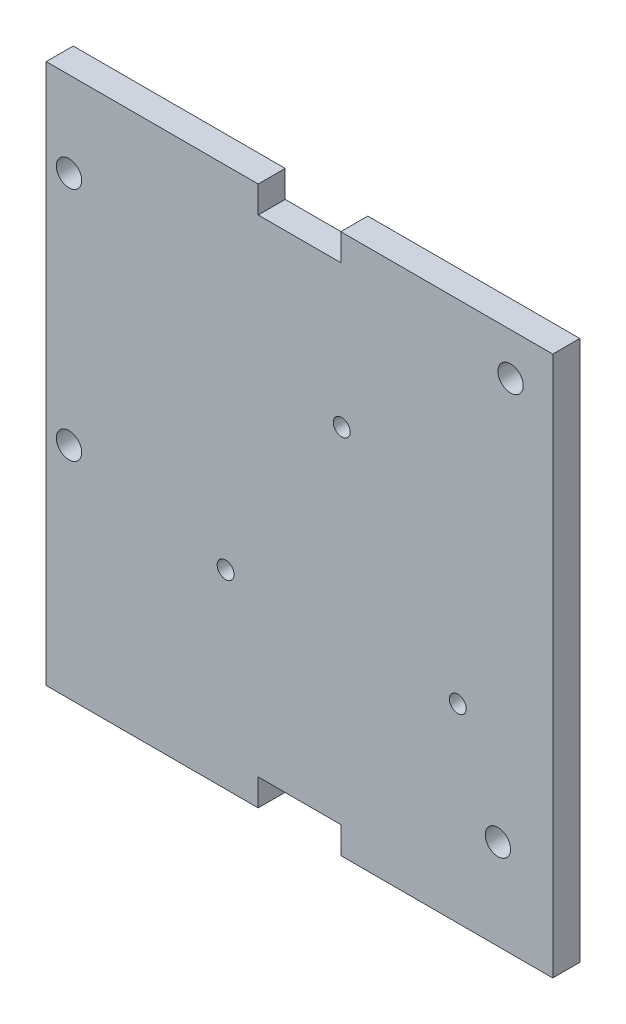
ISO-10303-21;
HEADER;
FILE_DESCRIPTION(('STEP AP214'),'2;1');
FILE_NAME('part.step','',(''),(''),'','','');
FILE_SCHEMA(('AUTOMOTIVE_DESIGN { 1 0 10303 214 1 1 1 1 }'));
ENDSEC;
DATA;
#1=APPLICATION_CONTEXT('core data for automotive mechanical design processes');
#2=APPLICATION_PROTOCOL_DEFINITION('international standard','automotive_design',2000,#1);
#3=PRODUCT_CONTEXT('',#1,'mechanical');
#4=PRODUCT('Part','Part','',(#3));
#5=PRODUCT_RELATED_PRODUCT_CATEGORY('part','',(#4));
#6=PRODUCT_DEFINITION_FORMATION('','',#4);
#7=PRODUCT_DEFINITION_CONTEXT('part definition',#1,'design');
#8=PRODUCT_DEFINITION('design','',#6,#7);
#9=PRODUCT_DEFINITION_SHAPE('','',#8);
#10=(LENGTH_UNIT() NAMED_UNIT(*) SI_UNIT(.MILLI.,.METRE.));
#11=(NAMED_UNIT(*) PLANE_ANGLE_UNIT() SI_UNIT($,.RADIAN.));
#12=(NAMED_UNIT(*) SI_UNIT($,.STERADIAN.) SOLID_ANGLE_UNIT());
#13=UNCERTAINTY_MEASURE_WITH_UNIT(LENGTH_MEASURE(1.E-05),#10,'distance_accuracy_value','');
#14=(GEOMETRIC_REPRESENTATION_CONTEXT(3) GLOBAL_UNCERTAINTY_ASSIGNED_CONTEXT((#13)) GLOBAL_UNIT_ASSIGNED_CONTEXT((#10,
#11,#12)) REPRESENTATION_CONTEXT('',''));
#15=CARTESIAN_POINT('',(0.,0.,0.));
#16=DIRECTION('',(0.,0.,1.));
#17=DIRECTION('',(1.,0.,0.));
#18=AXIS2_PLACEMENT_3D('',#15,#16,#17);
#19=CARTESIAN_POINT('',(-32.5493753276808,-8.36083374736063,3.2));
#20=DIRECTION('',(0.,1.,0.));
#21=DIRECTION('',(0.,0.,1.));
#22=AXIS2_PLACEMENT_3D('',#19,#20,#21);
#23=PLANE('',#22);
#24=DIRECTION('',(1.,0.,0.));
#25=VECTOR('',#24,1.);
#26=CARTESIAN_POINT('',(-32.5493753276808,-8.36083374736063,3.2));
#27=LINE('',#26,#25);
#28=CARTESIAN_POINT('',(2.34062467231918,-8.36083374736063,3.2));
#29=VERTEX_POINT('',#28);
#30=CARTESIAN_POINT('',(27.4506246723192,-8.36083374736063,3.2));
#31=VERTEX_POINT('',#30);
#32=EDGE_CURVE('E214',#29,#31,#27,.T.);
#33=ORIENTED_EDGE('',*,*,#32,.F.);
#34=DIRECTION('',(0.,0.,-1.));
#35=VECTOR('',#34,1.);
#36=CARTESIAN_POINT('',(2.34062467231918,-8.36083374736063,10.));
#37=LINE('',#36,#35);
#38=CARTESIAN_POINT('',(2.34062467231918,-8.36083374736063,0.));
#39=VERTEX_POINT('',#38);
#40=EDGE_CURVE('E213',#29,#39,#37,.T.);
#41=ORIENTED_EDGE('',*,*,#40,.T.);
#42=DIRECTION('',(1.,0.,0.));
#43=VECTOR('',#42,1.);
#44=CARTESIAN_POINT('',(-32.5493753276808,-8.36083374736063,0.));
#45=LINE('',#44,#43);
#46=CARTESIAN_POINT('',(27.4506246723192,-8.36083374736063,0.));
#47=VERTEX_POINT('',#46);
#48=EDGE_CURVE('E193',#39,#47,#45,.T.);
#49=ORIENTED_EDGE('',*,*,#48,.T.);
#50=DIRECTION('',(0.,0.,-1.));
#51=VECTOR('',#50,1.);
#52=CARTESIAN_POINT('',(27.4506246723192,-8.36083374736063,3.2));
#53=LINE('',#52,#51);
#54=EDGE_CURVE('E48',#31,#47,#53,.T.);
#55=ORIENTED_EDGE('',*,*,#54,.F.);
#56=EDGE_LOOP('',(#33,#41,#49,#55));
#57=FACE_BOUND('',#56,.T.);
#58=ADVANCED_FACE('F39',(#57),#23,.F.);
#59=CARTESIAN_POINT('',(-32.5493753276808,55.6391662526394,3.2));
#60=DIRECTION('',(0.,-1.,0.));
#61=DIRECTION('',(0.,0.,-1.));
#62=AXIS2_PLACEMENT_3D('',#59,#60,#61);
#63=PLANE('',#62);
#64=DIRECTION('',(-1.,0.,0.));
#65=VECTOR('',#64,1.);
#66=CARTESIAN_POINT('',(-32.5493753276808,55.6391662526394,3.2));
#67=LINE('',#66,#65);
#68=CARTESIAN_POINT('',(-7.43937532768082,55.6391662526394,3.2));
#69=VERTEX_POINT('',#68);
#70=CARTESIAN_POINT('',(-32.5493753276808,55.6391662526394,3.2));
#71=VERTEX_POINT('',#70);
#72=EDGE_CURVE('E151',#69,#71,#67,.T.);
#73=ORIENTED_EDGE('',*,*,#72,.F.);
#74=DIRECTION('',(0.,0.,-1.));
#75=VECTOR('',#74,1.);
#76=CARTESIAN_POINT('',(-7.43937532768082,55.6391662526394,10.));
#77=LINE('',#76,#75);
#78=CARTESIAN_POINT('',(-7.43937532768082,55.6391662526394,0.));
#79=VERTEX_POINT('',#78);
#80=EDGE_CURVE('E133',#69,#79,#77,.T.);
#81=ORIENTED_EDGE('',*,*,#80,.T.);
#82=DIRECTION('',(-1.,0.,0.));
#83=VECTOR('',#82,1.);
#84=CARTESIAN_POINT('',(-32.5493753276808,55.6391662526394,0.));
#85=LINE('',#84,#83);
#86=CARTESIAN_POINT('',(-32.5493753276808,55.6391662526394,0.));
#87=VERTEX_POINT('',#86);
#88=EDGE_CURVE('E149',#79,#87,#85,.T.);
#89=ORIENTED_EDGE('',*,*,#88,.T.);
#90=DIRECTION('',(0.,0.,-1.));
#91=VECTOR('',#90,1.);
#92=CARTESIAN_POINT('',(-32.5493753276808,55.6391662526394,3.2));
#93=LINE('',#92,#91);
#94=EDGE_CURVE('E172',#71,#87,#93,.T.);
#95=ORIENTED_EDGE('',*,*,#94,.F.);
#96=EDGE_LOOP('',(#73,#81,#89,#95));
#97=FACE_BOUND('',#96,.T.);
#98=ADVANCED_FACE('F147',(#97),#63,.F.);
#99=CARTESIAN_POINT('',(-32.5493753276808,-8.36083374736063,3.2));
#100=DIRECTION('',(1.,0.,0.));
#101=DIRECTION('',(0.,0.,-1.));
#102=AXIS2_PLACEMENT_3D('',#99,#100,#101);
#103=PLANE('',#102);
#104=DIRECTION('',(0.,-1.,0.));
#105=VECTOR('',#104,1.);
#106=CARTESIAN_POINT('',(-32.5493753276808,-8.36083374736063,0.));
#107=LINE('',#106,#105);
#108=CARTESIAN_POINT('',(-32.5493753276808,-8.36083374736063,0.));
#109=VERTEX_POINT('',#108);
#110=EDGE_CURVE('E159',#87,#109,#107,.T.);
#111=ORIENTED_EDGE('',*,*,#110,.T.);
#112=DIRECTION('',(0.,0.,-1.));
#113=VECTOR('',#112,1.);
#114=CARTESIAN_POINT('',(-32.5493753276808,-8.36083374736063,3.2));
#115=LINE('',#114,#113);
#116=CARTESIAN_POINT('',(-32.5493753276808,-8.36083374736063,3.2));
#117=VERTEX_POINT('',#116);
#118=EDGE_CURVE('E11',#117,#109,#115,.T.);
#119=ORIENTED_EDGE('',*,*,#118,.F.);
#120=DIRECTION('',(0.,-1.,0.));
#121=VECTOR('',#120,1.);
#122=CARTESIAN_POINT('',(-32.5493753276808,-8.36083374736063,3.2));
#123=LINE('',#122,#121);
#124=EDGE_CURVE('E167',#71,#117,#123,.T.);
#125=ORIENTED_EDGE('',*,*,#124,.F.);
#126=ORIENTED_EDGE('',*,*,#94,.T.);
#127=EDGE_LOOP('',(#111,#119,#125,#126));
#128=FACE_BOUND('',#127,.T.);
#129=ADVANCED_FACE('F41',(#128),#103,.F.);
#130=CARTESIAN_POINT('',(-7.43937532768082,-8.36083374736063,0.));
#131=VERTEX_POINT('',#130);
#132=EDGE_CURVE('E168',#109,#131,#45,.T.);
#133=ORIENTED_EDGE('',*,*,#132,.T.);
#134=DIRECTION('',(0.,0.,-1.));
#135=VECTOR('',#134,1.);
#136=CARTESIAN_POINT('',(-7.43937532768082,-8.36083374736063,10.));
#137=LINE('',#136,#135);
#138=CARTESIAN_POINT('',(-7.43937532768082,-8.36083374736063,3.2));
#139=VERTEX_POINT('',#138);
#140=EDGE_CURVE('E55',#139,#131,#137,.T.);
#141=ORIENTED_EDGE('',*,*,#140,.F.);
#142=EDGE_CURVE('E307',#117,#139,#27,.T.);
#143=ORIENTED_EDGE('',*,*,#142,.F.);
#144=ORIENTED_EDGE('',*,*,#118,.T.);
#145=EDGE_LOOP('',(#133,#141,#143,#144));
#146=FACE_BOUND('',#145,.T.);
#147=ADVANCED_FACE('F345',(#146),#23,.F.);
#148=CARTESIAN_POINT('',(27.4506246723192,-8.36083374736063,3.2));
#149=DIRECTION('',(-1.,0.,0.));
#150=DIRECTION('',(0.,0.,1.));
#151=AXIS2_PLACEMENT_3D('',#148,#149,#150);
#152=PLANE('',#151);
#153=DIRECTION('',(0.,1.,0.));
#154=VECTOR('',#153,1.);
#155=CARTESIAN_POINT('',(27.4506246723192,-8.36083374736063,0.));
#156=LINE('',#155,#154);
#157=CARTESIAN_POINT('',(27.4506246723192,55.6391662526394,0.));
#158=VERTEX_POINT('',#157);
#159=EDGE_CURVE('E162',#47,#158,#156,.T.);
#160=ORIENTED_EDGE('',*,*,#159,.T.);
#161=DIRECTION('',(0.,0.,-1.));
#162=VECTOR('',#161,1.);
#163=CARTESIAN_POINT('',(27.4506246723192,55.6391662526394,3.2));
#164=LINE('',#163,#162);
#165=CARTESIAN_POINT('',(27.4506246723192,55.6391662526394,3.2));
#166=VERTEX_POINT('',#165);
#167=EDGE_CURVE('E175',#166,#158,#164,.T.);
#168=ORIENTED_EDGE('',*,*,#167,.F.);
#169=DIRECTION('',(0.,1.,0.));
#170=VECTOR('',#169,1.);
#171=CARTESIAN_POINT('',(27.4506246723192,-8.36083374736063,3.2));
#172=LINE('',#171,#170);
#173=EDGE_CURVE('E187',#31,#166,#172,.T.);
#174=ORIENTED_EDGE('',*,*,#173,.F.);
#175=ORIENTED_EDGE('',*,*,#54,.T.);
#176=EDGE_LOOP('',(#160,#168,#174,#175));
#177=FACE_BOUND('',#176,.T.);
#178=ADVANCED_FACE('F185',(#177),#152,.F.);
#179=CARTESIAN_POINT('',(2.34062467231918,55.6391662526394,0.));
#180=VERTEX_POINT('',#179);
#181=EDGE_CURVE('E161',#158,#180,#85,.T.);
#182=ORIENTED_EDGE('',*,*,#181,.T.);
#183=DIRECTION('',(0.,0.,-1.));
#184=VECTOR('',#183,1.);
#185=CARTESIAN_POINT('',(2.34062467231918,55.6391662526394,10.));
#186=LINE('',#185,#184);
#187=CARTESIAN_POINT('',(2.34062467231918,55.6391662526394,3.2));
#188=VERTEX_POINT('',#187);
#189=EDGE_CURVE('E63',#188,#180,#186,.T.);
#190=ORIENTED_EDGE('',*,*,#189,.F.);
#191=EDGE_CURVE('E176',#166,#188,#67,.T.);
#192=ORIENTED_EDGE('',*,*,#191,.F.);
#193=ORIENTED_EDGE('',*,*,#167,.T.);
#194=EDGE_LOOP('',(#182,#190,#192,#193));
#195=FACE_BOUND('',#194,.T.);
#196=ADVANCED_FACE('F195',(#195),#63,.F.);
#197=CARTESIAN_POINT('',(0.,0.,3.2));
#198=DIRECTION('',(0.,0.,-1.));
#199=DIRECTION('',(-1.,0.,0.));
#200=AXIS2_PLACEMENT_3D('',#197,#198,#199);
#201=PLANE('',#200);
#202=CARTESIAN_POINT('',(2.45062467231918,35.6391662526394,3.2));
#203=DIRECTION('',(0.,0.,-1.));
#204=DIRECTION('',(-1.,0.,0.));
#205=AXIS2_PLACEMENT_3D('',#202,#203,#204);
#206=CIRCLE('',#205,1.);
#207=CARTESIAN_POINT('',(1.45062467231918,35.6391662526394,3.2));
#208=VERTEX_POINT('',#207);
#209=EDGE_CURVE('E251',#208,#208,#206,.T.);
#210=ORIENTED_EDGE('',*,*,#209,.T.);
#211=EDGE_LOOP('',(#210));
#212=FACE_BOUND('',#211,.T.);
#213=CARTESIAN_POINT('',(16.2006246723192,14.1391662526394,3.2));
#214=DIRECTION('',(0.,0.,-1.));
#215=DIRECTION('',(-1.,0.,0.));
#216=AXIS2_PLACEMENT_3D('',#213,#214,#215);
#217=CIRCLE('',#216,1.);
#218=CARTESIAN_POINT('',(15.2006246723192,14.1391662526394,3.2));
#219=VERTEX_POINT('',#218);
#220=EDGE_CURVE('E260',#219,#219,#217,.T.);
#221=ORIENTED_EDGE('',*,*,#220,.T.);
#222=EDGE_LOOP('',(#221));
#223=FACE_BOUND('',#222,.T.);
#224=CARTESIAN_POINT('',(-11.2993753276808,14.1391662526394,3.2));
#225=DIRECTION('',(0.,0.,-1.));
#226=DIRECTION('',(-1.,0.,0.));
#227=AXIS2_PLACEMENT_3D('',#224,#225,#226);
#228=CIRCLE('',#227,1.);
#229=CARTESIAN_POINT('',(-12.2993753276808,14.1391662526394,3.2));
#230=VERTEX_POINT('',#229);
#231=EDGE_CURVE('E268',#230,#230,#228,.T.);
#232=ORIENTED_EDGE('',*,*,#231,.T.);
#233=EDGE_LOOP('',(#232));
#234=FACE_BOUND('',#233,.T.);
#235=CARTESIAN_POINT('',(20.9506246723192,2.33916625263938,3.2));
#236=DIRECTION('',(0.,0.,1.));
#237=DIRECTION('',(1.,0.,0.));
#238=AXIS2_PLACEMENT_3D('',#235,#236,#237);
#239=CIRCLE('',#238,1.5);
#240=CARTESIAN_POINT('',(22.4506246723192,2.33916625263938,3.2));
#241=VERTEX_POINT('',#240);
#242=EDGE_CURVE('E278',#241,#241,#239,.T.);
#243=ORIENTED_EDGE('',*,*,#242,.F.);
#244=EDGE_LOOP('',(#243));
#245=FACE_BOUND('',#244,.T.);
#246=CARTESIAN_POINT('',(-29.8493753276808,45.5391662526394,3.2));
#247=DIRECTION('',(0.,0.,1.));
#248=DIRECTION('',(1.,0.,0.));
#249=AXIS2_PLACEMENT_3D('',#246,#247,#248);
#250=CIRCLE('',#249,1.5);
#251=CARTESIAN_POINT('',(-28.3493753276808,45.5391662526394,3.2));
#252=VERTEX_POINT('',#251);
#253=EDGE_CURVE('E255',#252,#252,#250,.T.);
#254=ORIENTED_EDGE('',*,*,#253,.F.);
#255=EDGE_LOOP('',(#254));
#256=FACE_BOUND('',#255,.T.);
#257=CARTESIAN_POINT('',(-29.8493753276808,17.6391662526394,3.2));
#258=DIRECTION('',(0.,0.,1.));
#259=DIRECTION('',(1.,0.,0.));
#260=AXIS2_PLACEMENT_3D('',#257,#258,#259);
#261=CIRCLE('',#260,1.5);
#262=CARTESIAN_POINT('',(-28.3493753276808,17.6391662526394,3.2));
#263=VERTEX_POINT('',#262);
#264=EDGE_CURVE('E287',#263,#263,#261,.T.);
#265=ORIENTED_EDGE('',*,*,#264,.F.);
#266=EDGE_LOOP('',(#265));
#267=FACE_BOUND('',#266,.T.);
#268=CARTESIAN_POINT('',(22.4506246723192,50.6391662526394,3.2));
#269=DIRECTION('',(0.,0.,1.));
#270=DIRECTION('',(1.,0.,0.));
#271=AXIS2_PLACEMENT_3D('',#268,#269,#270);
#272=CIRCLE('',#271,1.50000000000007);
#273=CARTESIAN_POINT('',(23.9506246723193,50.6391662526394,3.2));
#274=VERTEX_POINT('',#273);
#275=EDGE_CURVE('E294',#274,#274,#272,.T.);
#276=ORIENTED_EDGE('',*,*,#275,.F.);
#277=EDGE_LOOP('',(#276));
#278=FACE_BOUND('',#277,.T.);
#279=DIRECTION('',(-1.,0.,0.));
#280=VECTOR('',#279,1.);
#281=CARTESIAN_POINT('',(0.,52.4591662526394,3.2));
#282=LINE('',#281,#280);
#283=CARTESIAN_POINT('',(2.34062467231918,52.4591662526394,3.2));
#284=VERTEX_POINT('',#283);
#285=CARTESIAN_POINT('',(-7.43937532768082,52.4591662526394,3.2));
#286=VERTEX_POINT('',#285);
#287=EDGE_CURVE('E243',#284,#286,#282,.T.);
#288=ORIENTED_EDGE('',*,*,#287,.T.);
#289=DIRECTION('',(0.,1.,0.));
#290=VECTOR('',#289,1.);
#291=CARTESIAN_POINT('',(-7.43937532768082,0.,3.2));
#292=LINE('',#291,#290);
#293=EDGE_CURVE('E247',#286,#69,#292,.T.);
#294=ORIENTED_EDGE('',*,*,#293,.T.);
#295=ORIENTED_EDGE('',*,*,#72,.T.);
#296=ORIENTED_EDGE('',*,*,#124,.T.);
#297=ORIENTED_EDGE('',*,*,#142,.T.);
#298=DIRECTION('',(0.,1.,0.));
#299=VECTOR('',#298,1.);
#300=CARTESIAN_POINT('',(-7.43937532768082,0.,3.2));
#301=LINE('',#300,#299);
#302=CARTESIAN_POINT('',(-7.43937532768082,-5.18083374736063,3.2));
#303=VERTEX_POINT('',#302);
#304=EDGE_CURVE('E229',#139,#303,#301,.T.);
#305=ORIENTED_EDGE('',*,*,#304,.T.);
#306=DIRECTION('',(1.,0.,0.));
#307=VECTOR('',#306,1.);
#308=CARTESIAN_POINT('',(0.,-5.18083374736063,3.2));
#309=LINE('',#308,#307);
#310=CARTESIAN_POINT('',(2.34062467231918,-5.18083374736063,3.2));
#311=VERTEX_POINT('',#310);
#312=EDGE_CURVE('E233',#303,#311,#309,.T.);
#313=ORIENTED_EDGE('',*,*,#312,.T.);
#314=DIRECTION('',(0.,-1.,0.));
#315=VECTOR('',#314,1.);
#316=CARTESIAN_POINT('',(2.34062467231918,0.,3.2));
#317=LINE('',#316,#315);
#318=EDGE_CURVE('E237',#311,#29,#317,.T.);
#319=ORIENTED_EDGE('',*,*,#318,.T.);
#320=ORIENTED_EDGE('',*,*,#32,.T.);
#321=ORIENTED_EDGE('',*,*,#173,.T.);
#322=ORIENTED_EDGE('',*,*,#191,.T.);
#323=DIRECTION('',(0.,-1.,0.));
#324=VECTOR('',#323,1.);
#325=CARTESIAN_POINT('',(2.34062467231916,0.,3.2));
#326=LINE('',#325,#324);
#327=EDGE_CURVE('E240',#188,#284,#326,.T.);
#328=ORIENTED_EDGE('',*,*,#327,.T.);
#329=EDGE_LOOP('',(#288,#294,#295,#296,#297,#305,#313,#319,#320,#321,#322,#328));
#330=FACE_BOUND('',#329,.T.);
#331=ADVANCED_FACE('F312',(#212,#223,#234,#245,#256,#267,#278,#330),#201,.F.);
#332=CARTESIAN_POINT('',(0.,0.,0.));
#333=DIRECTION('',(0.,0.,-1.));
#334=DIRECTION('',(-1.,0.,0.));
#335=AXIS2_PLACEMENT_3D('',#332,#333,#334);
#336=PLANE('',#335);
#337=DIRECTION('',(0.,1.,0.));
#338=VECTOR('',#337,1.);
#339=CARTESIAN_POINT('',(-7.43937532768082,55.6391662526394,0.));
#340=LINE('',#339,#338);
#341=CARTESIAN_POINT('',(-7.43937532768082,52.4591662526394,0.));
#342=VERTEX_POINT('',#341);
#343=EDGE_CURVE('E130',#342,#79,#340,.T.);
#344=ORIENTED_EDGE('',*,*,#343,.F.);
#345=DIRECTION('',(-1.,0.,0.));
#346=VECTOR('',#345,1.);
#347=CARTESIAN_POINT('',(-7.43937532768082,52.4591662526394,0.));
#348=LINE('',#347,#346);
#349=CARTESIAN_POINT('',(2.34062467231918,52.4591662526394,0.));
#350=VERTEX_POINT('',#349);
#351=EDGE_CURVE('E153',#350,#342,#348,.T.);
#352=ORIENTED_EDGE('',*,*,#351,.F.);
#353=DIRECTION('',(0.,-1.,0.));
#354=VECTOR('',#353,1.);
#355=CARTESIAN_POINT('',(2.34062467231918,55.6391662526394,0.));
#356=LINE('',#355,#354);
#357=EDGE_CURVE('E142',#180,#350,#356,.T.);
#358=ORIENTED_EDGE('',*,*,#357,.F.);
#359=ORIENTED_EDGE('',*,*,#181,.F.);
#360=ORIENTED_EDGE('',*,*,#159,.F.);
#361=ORIENTED_EDGE('',*,*,#48,.F.);
#362=DIRECTION('',(0.,-1.,0.));
#363=VECTOR('',#362,1.);
#364=CARTESIAN_POINT('',(2.34062467231918,-8.36083374736063,0.));
#365=LINE('',#364,#363);
#366=CARTESIAN_POINT('',(2.34062467231918,-5.18083374736063,0.));
#367=VERTEX_POINT('',#366);
#368=EDGE_CURVE('E325',#367,#39,#365,.T.);
#369=ORIENTED_EDGE('',*,*,#368,.F.);
#370=DIRECTION('',(1.,0.,0.));
#371=VECTOR('',#370,1.);
#372=CARTESIAN_POINT('',(2.34062467231918,-5.18083374736063,0.));
#373=LINE('',#372,#371);
#374=CARTESIAN_POINT('',(-7.43937532768082,-5.18083374736063,0.));
#375=VERTEX_POINT('',#374);
#376=EDGE_CURVE('E218',#375,#367,#373,.T.);
#377=ORIENTED_EDGE('',*,*,#376,.F.);
#378=DIRECTION('',(0.,1.,0.));
#379=VECTOR('',#378,1.);
#380=CARTESIAN_POINT('',(-7.43937532768082,-8.36083374736063,0.));
#381=LINE('',#380,#379);
#382=EDGE_CURVE('E225',#131,#375,#381,.T.);
#383=ORIENTED_EDGE('',*,*,#382,.F.);
#384=ORIENTED_EDGE('',*,*,#132,.F.);
#385=ORIENTED_EDGE('',*,*,#110,.F.);
#386=ORIENTED_EDGE('',*,*,#88,.F.);
#387=EDGE_LOOP('',(#344,#352,#358,#359,#360,#361,#369,#377,#383,#384,#385,#386));
#388=FACE_BOUND('',#387,.T.);
#389=CARTESIAN_POINT('',(2.45062467231918,35.6391662526394,0.));
#390=DIRECTION('',(0.,0.,-1.));
#391=DIRECTION('',(-1.,0.,0.));
#392=AXIS2_PLACEMENT_3D('',#389,#390,#391);
#393=CIRCLE('',#392,1.);
#394=CARTESIAN_POINT('',(1.45062467231918,35.6391662526394,0.));
#395=VERTEX_POINT('',#394);
#396=EDGE_CURVE('E256',#395,#395,#393,.T.);
#397=ORIENTED_EDGE('',*,*,#396,.F.);
#398=EDGE_LOOP('',(#397));
#399=FACE_BOUND('',#398,.T.);
#400=CARTESIAN_POINT('',(16.2006246723192,14.1391662526394,0.));
#401=DIRECTION('',(0.,0.,-1.));
#402=DIRECTION('',(-1.,0.,0.));
#403=AXIS2_PLACEMENT_3D('',#400,#401,#402);
#404=CIRCLE('',#403,1.);
#405=CARTESIAN_POINT('',(15.2006246723192,14.1391662526394,0.));
#406=VERTEX_POINT('',#405);
#407=EDGE_CURVE('E264',#406,#406,#404,.T.);
#408=ORIENTED_EDGE('',*,*,#407,.F.);
#409=EDGE_LOOP('',(#408));
#410=FACE_BOUND('',#409,.T.);
#411=CARTESIAN_POINT('',(-11.2993753276808,14.1391662526394,0.));
#412=DIRECTION('',(0.,0.,-1.));
#413=DIRECTION('',(-1.,0.,0.));
#414=AXIS2_PLACEMENT_3D('',#411,#412,#413);
#415=CIRCLE('',#414,1.);
#416=CARTESIAN_POINT('',(-12.2993753276808,14.1391662526394,0.));
#417=VERTEX_POINT('',#416);
#418=EDGE_CURVE('E250',#417,#417,#415,.T.);
#419=ORIENTED_EDGE('',*,*,#418,.F.);
#420=EDGE_LOOP('',(#419));
#421=FACE_BOUND('',#420,.T.);
#422=CARTESIAN_POINT('',(20.9506246723192,2.33916625263938,0.));
#423=DIRECTION('',(0.,0.,1.));
#424=DIRECTION('',(1.,0.,0.));
#425=AXIS2_PLACEMENT_3D('',#422,#423,#424);
#426=CIRCLE('',#425,1.5);
#427=CARTESIAN_POINT('',(22.4506246723192,2.33916625263938,0.));
#428=VERTEX_POINT('',#427);
#429=EDGE_CURVE('E207',#428,#428,#426,.T.);
#430=ORIENTED_EDGE('',*,*,#429,.T.);
#431=EDGE_LOOP('',(#430));
#432=FACE_BOUND('',#431,.T.);
#433=CARTESIAN_POINT('',(-29.8493753276808,45.5391662526394,0.));
#434=DIRECTION('',(0.,0.,1.));
#435=DIRECTION('',(1.,0.,0.));
#436=AXIS2_PLACEMENT_3D('',#433,#434,#435);
#437=CIRCLE('',#436,1.5);
#438=CARTESIAN_POINT('',(-28.3493753276808,45.5391662526394,0.));
#439=VERTEX_POINT('',#438);
#440=EDGE_CURVE('E283',#439,#439,#437,.T.);
#441=ORIENTED_EDGE('',*,*,#440,.T.);
#442=EDGE_LOOP('',(#441));
#443=FACE_BOUND('',#442,.T.);
#444=CARTESIAN_POINT('',(-29.8493753276808,17.6391662526394,0.));
#445=DIRECTION('',(0.,0.,1.));
#446=DIRECTION('',(1.,0.,0.));
#447=AXIS2_PLACEMENT_3D('',#444,#445,#446);
#448=CIRCLE('',#447,1.5);
#449=CARTESIAN_POINT('',(-28.3493753276808,17.6391662526394,0.));
#450=VERTEX_POINT('',#449);
#451=EDGE_CURVE('E298',#450,#450,#448,.T.);
#452=ORIENTED_EDGE('',*,*,#451,.T.);
#453=EDGE_LOOP('',(#452));
#454=FACE_BOUND('',#453,.T.);
#455=CARTESIAN_POINT('',(22.4506246723192,50.6391662526394,0.));
#456=DIRECTION('',(0.,0.,1.));
#457=DIRECTION('',(1.,0.,0.));
#458=AXIS2_PLACEMENT_3D('',#455,#456,#457);
#459=CIRCLE('',#458,1.50000000000007);
#460=CARTESIAN_POINT('',(23.9506246723193,50.6391662526394,0.));
#461=VERTEX_POINT('',#460);
#462=EDGE_CURVE('E282',#461,#461,#459,.T.);
#463=ORIENTED_EDGE('',*,*,#462,.T.);
#464=EDGE_LOOP('',(#463));
#465=FACE_BOUND('',#464,.T.);
#466=ADVANCED_FACE('F156',(#388,#399,#410,#421,#432,#443,#454,#465),#336,.T.);
#467=CARTESIAN_POINT('',(22.4506246723192,50.6391662526394,0.));
#468=DIRECTION('',(0.,0.,1.));
#469=DIRECTION('',(1.,0.,0.));
#470=AXIS2_PLACEMENT_3D('',#467,#468,#469);
#471=CYLINDRICAL_SURFACE('',#470,1.50000000000007);
#472=ORIENTED_EDGE('',*,*,#462,.F.);
#473=EDGE_LOOP('',(#472));
#474=FACE_BOUND('',#473,.T.);
#475=ORIENTED_EDGE('',*,*,#275,.T.);
#476=EDGE_LOOP('',(#475));
#477=FACE_BOUND('',#476,.T.);
#478=ADVANCED_FACE('F369',(#474,#477),#471,.F.);
#479=CARTESIAN_POINT('',(-29.8493753276808,17.6391662526394,0.));
#480=DIRECTION('',(0.,0.,1.));
#481=DIRECTION('',(1.,0.,0.));
#482=AXIS2_PLACEMENT_3D('',#479,#480,#481);
#483=CYLINDRICAL_SURFACE('',#482,1.5);
#484=ORIENTED_EDGE('',*,*,#451,.F.);
#485=EDGE_LOOP('',(#484));
#486=FACE_BOUND('',#485,.T.);
#487=ORIENTED_EDGE('',*,*,#264,.T.);
#488=EDGE_LOOP('',(#487));
#489=FACE_BOUND('',#488,.T.);
#490=ADVANCED_FACE('F372',(#486,#489),#483,.F.);
#491=CARTESIAN_POINT('',(-29.8493753276808,45.5391662526394,0.));
#492=DIRECTION('',(0.,0.,1.));
#493=DIRECTION('',(1.,0.,0.));
#494=AXIS2_PLACEMENT_3D('',#491,#492,#493);
#495=CYLINDRICAL_SURFACE('',#494,1.5);
#496=ORIENTED_EDGE('',*,*,#440,.F.);
#497=EDGE_LOOP('',(#496));
#498=FACE_BOUND('',#497,.T.);
#499=ORIENTED_EDGE('',*,*,#253,.T.);
#500=EDGE_LOOP('',(#499));
#501=FACE_BOUND('',#500,.T.);
#502=ADVANCED_FACE('F375',(#498,#501),#495,.F.);
#503=CARTESIAN_POINT('',(20.9506246723192,2.33916625263938,0.));
#504=DIRECTION('',(0.,0.,1.));
#505=DIRECTION('',(1.,0.,0.));
#506=AXIS2_PLACEMENT_3D('',#503,#504,#505);
#507=CYLINDRICAL_SURFACE('',#506,1.5);
#508=ORIENTED_EDGE('',*,*,#429,.F.);
#509=EDGE_LOOP('',(#508));
#510=FACE_BOUND('',#509,.T.);
#511=ORIENTED_EDGE('',*,*,#242,.T.);
#512=EDGE_LOOP('',(#511));
#513=FACE_BOUND('',#512,.T.);
#514=ADVANCED_FACE('F382',(#510,#513),#507,.F.);
#515=CARTESIAN_POINT('',(-11.2993753276808,14.1391662526394,3.2));
#516=DIRECTION('',(0.,0.,-1.));
#517=DIRECTION('',(-1.,0.,0.));
#518=AXIS2_PLACEMENT_3D('',#515,#516,#517);
#519=CYLINDRICAL_SURFACE('',#518,1.);
#520=ORIENTED_EDGE('',*,*,#231,.F.);
#521=EDGE_LOOP('',(#520));
#522=FACE_BOUND('',#521,.T.);
#523=ORIENTED_EDGE('',*,*,#418,.T.);
#524=EDGE_LOOP('',(#523));
#525=FACE_BOUND('',#524,.T.);
#526=ADVANCED_FACE('F386',(#522,#525),#519,.F.);
#527=CARTESIAN_POINT('',(16.2006246723192,14.1391662526394,3.2));
#528=DIRECTION('',(0.,0.,-1.));
#529=DIRECTION('',(-1.,0.,0.));
#530=AXIS2_PLACEMENT_3D('',#527,#528,#529);
#531=CYLINDRICAL_SURFACE('',#530,1.);
#532=ORIENTED_EDGE('',*,*,#220,.F.);
#533=EDGE_LOOP('',(#532));
#534=FACE_BOUND('',#533,.T.);
#535=ORIENTED_EDGE('',*,*,#407,.T.);
#536=EDGE_LOOP('',(#535));
#537=FACE_BOUND('',#536,.T.);
#538=ADVANCED_FACE('F390',(#534,#537),#531,.F.);
#539=CARTESIAN_POINT('',(2.45062467231918,35.6391662526394,3.2));
#540=DIRECTION('',(0.,0.,-1.));
#541=DIRECTION('',(-1.,0.,0.));
#542=AXIS2_PLACEMENT_3D('',#539,#540,#541);
#543=CYLINDRICAL_SURFACE('',#542,1.);
#544=ORIENTED_EDGE('',*,*,#209,.F.);
#545=EDGE_LOOP('',(#544));
#546=FACE_BOUND('',#545,.T.);
#547=ORIENTED_EDGE('',*,*,#396,.T.);
#548=EDGE_LOOP('',(#547));
#549=FACE_BOUND('',#548,.T.);
#550=ADVANCED_FACE('F394',(#546,#549),#543,.F.);
#551=CARTESIAN_POINT('',(2.34062467231918,-8.36083374736063,10.));
#552=DIRECTION('',(1.,0.,0.));
#553=DIRECTION('',(0.,0.,-1.));
#554=AXIS2_PLACEMENT_3D('',#551,#552,#553);
#555=PLANE('',#554);
#556=DIRECTION('',(0.,0.,-1.));
#557=VECTOR('',#556,1.);
#558=CARTESIAN_POINT('',(2.34062467231918,-5.18083374736063,10.));
#559=LINE('',#558,#557);
#560=EDGE_CURVE('E143',#311,#367,#559,.T.);
#561=ORIENTED_EDGE('',*,*,#560,.T.);
#562=ORIENTED_EDGE('',*,*,#368,.T.);
#563=ORIENTED_EDGE('',*,*,#40,.F.);
#564=ORIENTED_EDGE('',*,*,#318,.F.);
#565=EDGE_LOOP('',(#561,#562,#563,#564));
#566=FACE_BOUND('',#565,.T.);
#567=ADVANCED_FACE('F314',(#566),#555,.F.);
#568=CARTESIAN_POINT('',(2.34062467231918,-5.18083374736063,10.));
#569=DIRECTION('',(0.,1.,0.));
#570=DIRECTION('',(0.,0.,1.));
#571=AXIS2_PLACEMENT_3D('',#568,#569,#570);
#572=PLANE('',#571);
#573=DIRECTION('',(0.,0.,-1.));
#574=VECTOR('',#573,1.);
#575=CARTESIAN_POINT('',(-7.43937532768082,-5.18083374736063,10.));
#576=LINE('',#575,#574);
#577=EDGE_CURVE('E222',#303,#375,#576,.T.);
#578=ORIENTED_EDGE('',*,*,#577,.T.);
#579=ORIENTED_EDGE('',*,*,#376,.T.);
#580=ORIENTED_EDGE('',*,*,#560,.F.);
#581=ORIENTED_EDGE('',*,*,#312,.F.);
#582=EDGE_LOOP('',(#578,#579,#580,#581));
#583=FACE_BOUND('',#582,.T.);
#584=ADVANCED_FACE('F316',(#583),#572,.F.);
#585=CARTESIAN_POINT('',(-7.43937532768082,-8.36083374736063,10.));
#586=DIRECTION('',(-1.,0.,0.));
#587=DIRECTION('',(0.,-1.,0.));
#588=AXIS2_PLACEMENT_3D('',#585,#586,#587);
#589=PLANE('',#588);
#590=ORIENTED_EDGE('',*,*,#140,.T.);
#591=ORIENTED_EDGE('',*,*,#382,.T.);
#592=ORIENTED_EDGE('',*,*,#577,.F.);
#593=ORIENTED_EDGE('',*,*,#304,.F.);
#594=EDGE_LOOP('',(#590,#591,#592,#593));
#595=FACE_BOUND('',#594,.T.);
#596=ADVANCED_FACE('F401',(#595),#589,.F.);
#597=CARTESIAN_POINT('',(-7.43937532768082,55.6391662526394,10.));
#598=DIRECTION('',(-1.,0.,0.));
#599=DIRECTION('',(0.,0.,1.));
#600=AXIS2_PLACEMENT_3D('',#597,#598,#599);
#601=PLANE('',#600);
#602=DIRECTION('',(0.,0.,-1.));
#603=VECTOR('',#602,1.);
#604=CARTESIAN_POINT('',(-7.43937532768082,52.4591662526394,10.));
#605=LINE('',#604,#603);
#606=EDGE_CURVE('E136',#286,#342,#605,.T.);
#607=ORIENTED_EDGE('',*,*,#606,.T.);
#608=ORIENTED_EDGE('',*,*,#343,.T.);
#609=ORIENTED_EDGE('',*,*,#80,.F.);
#610=ORIENTED_EDGE('',*,*,#293,.F.);
#611=EDGE_LOOP('',(#607,#608,#609,#610));
#612=FACE_BOUND('',#611,.T.);
#613=ADVANCED_FACE('F132',(#612),#601,.F.);
#614=CARTESIAN_POINT('',(-7.43937532768082,52.4591662526394,10.));
#615=DIRECTION('',(0.,-1.,0.));
#616=DIRECTION('',(0.,0.,-1.));
#617=AXIS2_PLACEMENT_3D('',#614,#615,#616);
#618=PLANE('',#617);
#619=DIRECTION('',(0.,0.,-1.));
#620=VECTOR('',#619,1.);
#621=CARTESIAN_POINT('',(2.34062467231918,52.4591662526394,10.));
#622=LINE('',#621,#620);
#623=EDGE_CURVE('E330',#284,#350,#622,.T.);
#624=ORIENTED_EDGE('',*,*,#623,.T.);
#625=ORIENTED_EDGE('',*,*,#351,.T.);
#626=ORIENTED_EDGE('',*,*,#606,.F.);
#627=ORIENTED_EDGE('',*,*,#287,.F.);
#628=EDGE_LOOP('',(#624,#625,#626,#627));
#629=FACE_BOUND('',#628,.T.);
#630=ADVANCED_FACE('F341',(#629),#618,.F.);
#631=CARTESIAN_POINT('',(2.34062467231918,55.6391662526394,10.));
#632=DIRECTION('',(1.,0.,0.));
#633=DIRECTION('',(0.,1.,0.));
#634=AXIS2_PLACEMENT_3D('',#631,#632,#633);
#635=PLANE('',#634);
#636=ORIENTED_EDGE('',*,*,#189,.T.);
#637=ORIENTED_EDGE('',*,*,#357,.T.);
#638=ORIENTED_EDGE('',*,*,#623,.F.);
#639=ORIENTED_EDGE('',*,*,#327,.F.);
#640=EDGE_LOOP('',(#636,#637,#638,#639));
#641=FACE_BOUND('',#640,.T.);
#642=ADVANCED_FACE('F339',(#641),#635,.F.);
#643=CLOSED_SHELL('',(#58,#98,#129,#147,#178,#196,#331,#466,#478,#490,#502,#514,#526,#538,#550,
#567,#584,#596,#613,#630,#642));
#644=MANIFOLD_SOLID_BREP('B2',#643);
#645=ADVANCED_BREP_SHAPE_REPRESENTATION('',(#18,#644),#14);
#646=SHAPE_DEFINITION_REPRESENTATION(#9,#645);
ENDSEC;
END-ISO-10303-21;
